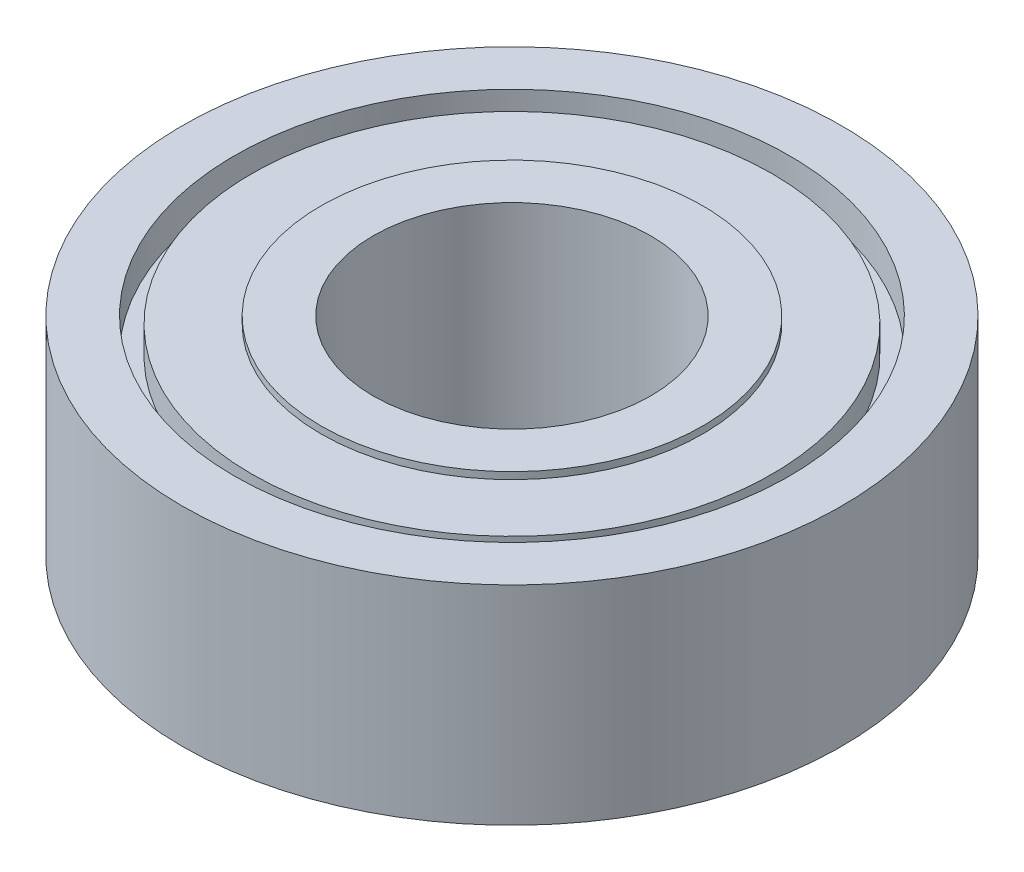
ISO-10303-21;
HEADER;
FILE_DESCRIPTION(('STEP AP214'),'2;1');
FILE_NAME('part.step','',(''),(''),'','','');
FILE_SCHEMA(('AUTOMOTIVE_DESIGN { 1 0 10303 214 1 1 1 1 }'));
ENDSEC;
DATA;
#1=APPLICATION_CONTEXT('core data for automotive mechanical design processes');
#2=APPLICATION_PROTOCOL_DEFINITION('international standard','automotive_design',2000,#1);
#3=PRODUCT_CONTEXT('',#1,'mechanical');
#4=PRODUCT('Part','Part','',(#3));
#5=PRODUCT_RELATED_PRODUCT_CATEGORY('part','',(#4));
#6=PRODUCT_DEFINITION_FORMATION('','',#4);
#7=PRODUCT_DEFINITION_CONTEXT('part definition',#1,'design');
#8=PRODUCT_DEFINITION('design','',#6,#7);
#9=PRODUCT_DEFINITION_SHAPE('','',#8);
#10=(LENGTH_UNIT() NAMED_UNIT(*) SI_UNIT(.MILLI.,.METRE.));
#11=(NAMED_UNIT(*) PLANE_ANGLE_UNIT() SI_UNIT($,.RADIAN.));
#12=(NAMED_UNIT(*) SI_UNIT($,.STERADIAN.) SOLID_ANGLE_UNIT());
#13=UNCERTAINTY_MEASURE_WITH_UNIT(LENGTH_MEASURE(1.E-05),#10,'distance_accuracy_value','');
#14=(GEOMETRIC_REPRESENTATION_CONTEXT(3) GLOBAL_UNCERTAINTY_ASSIGNED_CONTEXT((#13)) GLOBAL_UNIT_ASSIGNED_CONTEXT((#10,
#11,#12)) REPRESENTATION_CONTEXT('',''));
#15=CARTESIAN_POINT('',(0.,0.,0.));
#16=DIRECTION('',(0.,0.,1.));
#17=DIRECTION('',(1.,0.,0.));
#18=AXIS2_PLACEMENT_3D('',#15,#16,#17);
#19=CARTESIAN_POINT('',(0.,2.8,0.));
#20=DIRECTION('',(0.,-1.,0.));
#21=DIRECTION('',(0.,0.,-1.));
#22=AXIS2_PLACEMENT_3D('',#19,#20,#21);
#23=CYLINDRICAL_SURFACE('',#22,7.5);
#24=CARTESIAN_POINT('',(0.,-2.8,0.));
#25=DIRECTION('',(0.,1.,0.));
#26=DIRECTION('',(0.,0.,1.));
#27=AXIS2_PLACEMENT_3D('',#24,#25,#26);
#28=CIRCLE('',#27,7.5);
#29=CARTESIAN_POINT('',(0.,-2.8,7.5));
#30=VERTEX_POINT('',#29);
#31=EDGE_CURVE('E64',#30,#30,#28,.T.);
#32=ORIENTED_EDGE('',*,*,#31,.T.);
#33=EDGE_LOOP('',(#32));
#34=FACE_BOUND('',#33,.T.);
#35=CARTESIAN_POINT('',(0.,-2.,0.));
#36=DIRECTION('',(0.,1.,0.));
#37=DIRECTION('',(0.,0.,1.));
#38=AXIS2_PLACEMENT_3D('',#35,#36,#37);
#39=CIRCLE('',#38,7.5);
#40=CARTESIAN_POINT('',(0.,-2.,7.5));
#41=VERTEX_POINT('',#40);
#42=EDGE_CURVE('E10',#41,#41,#39,.T.);
#43=ORIENTED_EDGE('',*,*,#42,.F.);
#44=EDGE_LOOP('',(#43));
#45=FACE_BOUND('',#44,.T.);
#46=ADVANCED_FACE('F37',(#34,#45),#23,.T.);
#47=CARTESIAN_POINT('',(0.,3.,0.));
#48=DIRECTION('',(0.,-1.,0.));
#49=DIRECTION('',(0.,0.,-1.));
#50=AXIS2_PLACEMENT_3D('',#47,#48,#49);
#51=CYLINDRICAL_SURFACE('',#50,5.5);
#52=CARTESIAN_POINT('',(0.,-3.,0.));
#53=DIRECTION('',(0.,1.,0.));
#54=DIRECTION('',(0.,0.,1.));
#55=AXIS2_PLACEMENT_3D('',#52,#53,#54);
#56=CIRCLE('',#55,5.5);
#57=CARTESIAN_POINT('',(0.,-3.,5.5));
#58=VERTEX_POINT('',#57);
#59=EDGE_CURVE('E52',#58,#58,#56,.T.);
#60=ORIENTED_EDGE('',*,*,#59,.T.);
#61=EDGE_LOOP('',(#60));
#62=FACE_BOUND('',#61,.T.);
#63=CARTESIAN_POINT('',(0.,-2.8,0.));
#64=DIRECTION('',(0.,1.,0.));
#65=DIRECTION('',(0.,0.,1.));
#66=AXIS2_PLACEMENT_3D('',#63,#64,#65);
#67=CIRCLE('',#66,5.5);
#68=CARTESIAN_POINT('',(0.,-2.8,5.5));
#69=VERTEX_POINT('',#68);
#70=EDGE_CURVE('E44',#69,#69,#67,.T.);
#71=ORIENTED_EDGE('',*,*,#70,.F.);
#72=EDGE_LOOP('',(#71));
#73=FACE_BOUND('',#72,.T.);
#74=ADVANCED_FACE('F113',(#62,#73),#51,.T.);
#75=CARTESIAN_POINT('',(0.,3.,0.));
#76=DIRECTION('',(0.,1.,0.));
#77=DIRECTION('',(0.,0.,1.));
#78=AXIS2_PLACEMENT_3D('',#75,#76,#77);
#79=PLANE('',#78);
#80=CARTESIAN_POINT('',(0.,3.,0.));
#81=DIRECTION('',(0.,1.,0.));
#82=DIRECTION('',(0.,0.,1.));
#83=AXIS2_PLACEMENT_3D('',#80,#81,#82);
#84=CIRCLE('',#83,5.5);
#85=CARTESIAN_POINT('',(0.,3.,5.5));
#86=VERTEX_POINT('',#85);
#87=EDGE_CURVE('E48',#86,#86,#84,.T.);
#88=ORIENTED_EDGE('',*,*,#87,.T.);
#89=EDGE_LOOP('',(#88));
#90=FACE_BOUND('',#89,.T.);
#91=CARTESIAN_POINT('',(0.,3.,0.));
#92=DIRECTION('',(0.,1.,0.));
#93=DIRECTION('',(0.,0.,1.));
#94=AXIS2_PLACEMENT_3D('',#91,#92,#93);
#95=CIRCLE('',#94,4.);
#96=CARTESIAN_POINT('',(0.,3.,4.));
#97=VERTEX_POINT('',#96);
#98=EDGE_CURVE('E56',#97,#97,#95,.T.);
#99=ORIENTED_EDGE('',*,*,#98,.F.);
#100=EDGE_LOOP('',(#99));
#101=FACE_BOUND('',#100,.T.);
#102=ADVANCED_FACE('F120',(#90,#101),#79,.T.);
#103=CARTESIAN_POINT('',(0.,-3.,0.));
#104=DIRECTION('',(0.,1.,0.));
#105=DIRECTION('',(0.,0.,1.));
#106=AXIS2_PLACEMENT_3D('',#103,#104,#105);
#107=PLANE('',#106);
#108=ORIENTED_EDGE('',*,*,#59,.F.);
#109=EDGE_LOOP('',(#108));
#110=FACE_BOUND('',#109,.T.);
#111=CARTESIAN_POINT('',(0.,-3.,0.));
#112=DIRECTION('',(0.,1.,0.));
#113=DIRECTION('',(0.,0.,1.));
#114=AXIS2_PLACEMENT_3D('',#111,#112,#113);
#115=CIRCLE('',#114,4.);
#116=CARTESIAN_POINT('',(0.,-3.,4.));
#117=VERTEX_POINT('',#116);
#118=EDGE_CURVE('E58',#117,#117,#115,.T.);
#119=ORIENTED_EDGE('',*,*,#118,.T.);
#120=EDGE_LOOP('',(#119));
#121=FACE_BOUND('',#120,.T.);
#122=ADVANCED_FACE('F149',(#110,#121),#107,.F.);
#123=CARTESIAN_POINT('',(0.,2.8,0.));
#124=DIRECTION('',(0.,1.,0.));
#125=DIRECTION('',(0.,0.,1.));
#126=AXIS2_PLACEMENT_3D('',#123,#124,#125);
#127=CIRCLE('',#126,5.5);
#128=CARTESIAN_POINT('',(0.,2.8,5.5));
#129=VERTEX_POINT('',#128);
#130=EDGE_CURVE('E67',#129,#129,#127,.T.);
#131=ORIENTED_EDGE('',*,*,#130,.T.);
#132=EDGE_LOOP('',(#131));
#133=FACE_BOUND('',#132,.T.);
#134=ORIENTED_EDGE('',*,*,#87,.F.);
#135=EDGE_LOOP('',(#134));
#136=FACE_BOUND('',#135,.T.);
#137=ADVANCED_FACE('F39',(#133,#136),#51,.T.);
#138=CARTESIAN_POINT('',(0.,3.,0.));
#139=DIRECTION('',(0.,-1.,0.));
#140=DIRECTION('',(0.,0.,-1.));
#141=AXIS2_PLACEMENT_3D('',#138,#139,#140);
#142=CYLINDRICAL_SURFACE('',#141,4.);
#143=ORIENTED_EDGE('',*,*,#98,.T.);
#144=EDGE_LOOP('',(#143));
#145=FACE_BOUND('',#144,.T.);
#146=ORIENTED_EDGE('',*,*,#118,.F.);
#147=EDGE_LOOP('',(#146));
#148=FACE_BOUND('',#147,.T.);
#149=ADVANCED_FACE('F143',(#145,#148),#142,.F.);
#150=CARTESIAN_POINT('',(0.,2.8,0.));
#151=DIRECTION('',(0.,1.,0.));
#152=DIRECTION('',(0.,0.,1.));
#153=AXIS2_PLACEMENT_3D('',#150,#151,#152);
#154=PLANE('',#153);
#155=CARTESIAN_POINT('',(0.,2.8,0.));
#156=DIRECTION('',(0.,1.,0.));
#157=DIRECTION('',(0.,0.,1.));
#158=AXIS2_PLACEMENT_3D('',#155,#156,#157);
#159=CIRCLE('',#158,7.5);
#160=CARTESIAN_POINT('',(0.,2.8,7.5));
#161=VERTEX_POINT('',#160);
#162=EDGE_CURVE('E61',#161,#161,#159,.T.);
#163=ORIENTED_EDGE('',*,*,#162,.T.);
#164=EDGE_LOOP('',(#163));
#165=FACE_BOUND('',#164,.T.);
#166=ORIENTED_EDGE('',*,*,#130,.F.);
#167=EDGE_LOOP('',(#166));
#168=FACE_BOUND('',#167,.T.);
#169=ADVANCED_FACE('F135',(#165,#168),#154,.T.);
#170=CARTESIAN_POINT('',(0.,-2.8,0.));
#171=DIRECTION('',(0.,1.,0.));
#172=DIRECTION('',(0.,0.,1.));
#173=AXIS2_PLACEMENT_3D('',#170,#171,#172);
#174=PLANE('',#173);
#175=ORIENTED_EDGE('',*,*,#31,.F.);
#176=EDGE_LOOP('',(#175));
#177=FACE_BOUND('',#176,.T.);
#178=ORIENTED_EDGE('',*,*,#70,.T.);
#179=EDGE_LOOP('',(#178));
#180=FACE_BOUND('',#179,.T.);
#181=ADVANCED_FACE('F127',(#177,#180),#174,.F.);
#182=CARTESIAN_POINT('',(0.,2.,0.));
#183=DIRECTION('',(0.,1.,0.));
#184=DIRECTION('',(0.,0.,1.));
#185=AXIS2_PLACEMENT_3D('',#182,#183,#184);
#186=CIRCLE('',#185,7.5);
#187=CARTESIAN_POINT('',(0.,2.,7.5));
#188=VERTEX_POINT('',#187);
#189=EDGE_CURVE('E72',#188,#188,#186,.T.);
#190=ORIENTED_EDGE('',*,*,#189,.T.);
#191=EDGE_LOOP('',(#190));
#192=FACE_BOUND('',#191,.T.);
#193=ORIENTED_EDGE('',*,*,#162,.F.);
#194=EDGE_LOOP('',(#193));
#195=FACE_BOUND('',#194,.T.);
#196=ADVANCED_FACE('F116',(#192,#195),#23,.T.);
#197=CARTESIAN_POINT('',(0.,2.,0.));
#198=DIRECTION('',(0.,1.,0.));
#199=DIRECTION('',(0.,0.,1.));
#200=AXIS2_PLACEMENT_3D('',#197,#198,#199);
#201=PLANE('',#200);
#202=ORIENTED_EDGE('',*,*,#189,.F.);
#203=EDGE_LOOP('',(#202));
#204=FACE_BOUND('',#203,.T.);
#205=CARTESIAN_POINT('',(0.,2.,0.));
#206=DIRECTION('',(0.,1.,0.));
#207=DIRECTION('',(0.,0.,1.));
#208=AXIS2_PLACEMENT_3D('',#205,#206,#207);
#209=CIRCLE('',#208,8.);
#210=CARTESIAN_POINT('',(0.,2.,8.));
#211=VERTEX_POINT('',#210);
#212=EDGE_CURVE('E76',#211,#211,#209,.F.);
#213=ORIENTED_EDGE('',*,*,#212,.F.);
#214=EDGE_LOOP('',(#213));
#215=FACE_BOUND('',#214,.T.);
#216=ADVANCED_FACE('F126',(#204,#215),#201,.T.);
#217=CARTESIAN_POINT('',(0.,-2.,0.));
#218=DIRECTION('',(0.,1.,0.));
#219=DIRECTION('',(0.,0.,1.));
#220=AXIS2_PLACEMENT_3D('',#217,#218,#219);
#221=PLANE('',#220);
#222=ORIENTED_EDGE('',*,*,#42,.T.);
#223=EDGE_LOOP('',(#222));
#224=FACE_BOUND('',#223,.T.);
#225=CARTESIAN_POINT('',(0.,-2.,0.));
#226=DIRECTION('',(0.,1.,0.));
#227=DIRECTION('',(0.,0.,1.));
#228=AXIS2_PLACEMENT_3D('',#225,#226,#227);
#229=CIRCLE('',#228,8.);
#230=CARTESIAN_POINT('',(0.,-2.,8.));
#231=VERTEX_POINT('',#230);
#232=EDGE_CURVE('E73',#231,#231,#229,.T.);
#233=ORIENTED_EDGE('',*,*,#232,.F.);
#234=EDGE_LOOP('',(#233));
#235=FACE_BOUND('',#234,.T.);
#236=ADVANCED_FACE('F109',(#224,#235),#221,.F.);
#237=CARTESIAN_POINT('',(0.,3.,0.));
#238=DIRECTION('',(0.,-1.,0.));
#239=DIRECTION('',(0.,0.,-1.));
#240=AXIS2_PLACEMENT_3D('',#237,#238,#239);
#241=CYLINDRICAL_SURFACE('',#240,8.);
#242=CARTESIAN_POINT('',(0.,-3.,0.));
#243=DIRECTION('',(0.,1.,0.));
#244=DIRECTION('',(0.,0.,1.));
#245=AXIS2_PLACEMENT_3D('',#242,#243,#244);
#246=CIRCLE('',#245,8.);
#247=CARTESIAN_POINT('',(0.,-3.,8.));
#248=VERTEX_POINT('',#247);
#249=EDGE_CURVE('E88',#248,#248,#246,.T.);
#250=ORIENTED_EDGE('',*,*,#249,.F.);
#251=EDGE_LOOP('',(#250));
#252=FACE_BOUND('',#251,.T.);
#253=ORIENTED_EDGE('',*,*,#232,.T.);
#254=EDGE_LOOP('',(#253));
#255=FACE_BOUND('',#254,.T.);
#256=ADVANCED_FACE('F99',(#252,#255),#241,.F.);
#257=CARTESIAN_POINT('',(0.,3.,0.));
#258=DIRECTION('',(0.,1.,0.));
#259=DIRECTION('',(0.,0.,1.));
#260=AXIS2_PLACEMENT_3D('',#257,#258,#259);
#261=PLANE('',#260);
#262=CARTESIAN_POINT('',(0.,3.,0.));
#263=DIRECTION('',(0.,1.,0.));
#264=DIRECTION('',(0.,0.,1.));
#265=AXIS2_PLACEMENT_3D('',#262,#263,#264);
#266=CIRCLE('',#265,9.5);
#267=CARTESIAN_POINT('',(0.,3.,9.5));
#268=VERTEX_POINT('',#267);
#269=EDGE_CURVE('E81',#268,#268,#266,.T.);
#270=ORIENTED_EDGE('',*,*,#269,.T.);
#271=EDGE_LOOP('',(#270));
#272=FACE_BOUND('',#271,.T.);
#273=CARTESIAN_POINT('',(0.,3.,0.));
#274=DIRECTION('',(0.,1.,0.));
#275=DIRECTION('',(0.,0.,1.));
#276=AXIS2_PLACEMENT_3D('',#273,#274,#275);
#277=CIRCLE('',#276,8.);
#278=CARTESIAN_POINT('',(0.,3.,8.));
#279=VERTEX_POINT('',#278);
#280=EDGE_CURVE('E85',#279,#279,#277,.T.);
#281=ORIENTED_EDGE('',*,*,#280,.F.);
#282=EDGE_LOOP('',(#281));
#283=FACE_BOUND('',#282,.T.);
#284=ADVANCED_FACE('F96',(#272,#283),#261,.T.);
#285=CARTESIAN_POINT('',(0.,-3.,0.));
#286=DIRECTION('',(0.,1.,0.));
#287=DIRECTION('',(0.,0.,1.));
#288=AXIS2_PLACEMENT_3D('',#285,#286,#287);
#289=PLANE('',#288);
#290=CARTESIAN_POINT('',(0.,-3.,0.));
#291=DIRECTION('',(0.,1.,0.));
#292=DIRECTION('',(0.,0.,1.));
#293=AXIS2_PLACEMENT_3D('',#290,#291,#292);
#294=CIRCLE('',#293,9.5);
#295=CARTESIAN_POINT('',(0.,-3.,9.5));
#296=VERTEX_POINT('',#295);
#297=EDGE_CURVE('E82',#296,#296,#294,.T.);
#298=ORIENTED_EDGE('',*,*,#297,.F.);
#299=EDGE_LOOP('',(#298));
#300=FACE_BOUND('',#299,.T.);
#301=ORIENTED_EDGE('',*,*,#249,.T.);
#302=EDGE_LOOP('',(#301));
#303=FACE_BOUND('',#302,.T.);
#304=ADVANCED_FACE('F98',(#300,#303),#289,.F.);
#305=CARTESIAN_POINT('',(0.,3.,0.));
#306=DIRECTION('',(0.,-1.,0.));
#307=DIRECTION('',(0.,0.,-1.));
#308=AXIS2_PLACEMENT_3D('',#305,#306,#307);
#309=CYLINDRICAL_SURFACE('',#308,9.5);
#310=ORIENTED_EDGE('',*,*,#269,.F.);
#311=EDGE_LOOP('',(#310));
#312=FACE_BOUND('',#311,.T.);
#313=ORIENTED_EDGE('',*,*,#297,.T.);
#314=EDGE_LOOP('',(#313));
#315=FACE_BOUND('',#314,.T.);
#316=ADVANCED_FACE('F106',(#312,#315),#309,.T.);
#317=ORIENTED_EDGE('',*,*,#212,.T.);
#318=EDGE_LOOP('',(#317));
#319=FACE_BOUND('',#318,.T.);
#320=ORIENTED_EDGE('',*,*,#280,.T.);
#321=EDGE_LOOP('',(#320));
#322=FACE_BOUND('',#321,.T.);
#323=ADVANCED_FACE('F94',(#319,#322),#241,.F.);
#324=CLOSED_SHELL('',(#46,#74,#102,#122,#137,#149,#169,#181,#196,#216,#236,#256,#284,#304,#316,#323));
#325=MANIFOLD_SOLID_BREP('B2',#324);
#326=ADVANCED_BREP_SHAPE_REPRESENTATION('',(#18,#325),#14);
#327=SHAPE_DEFINITION_REPRESENTATION(#9,#326);
ENDSEC;
END-ISO-10303-21;
